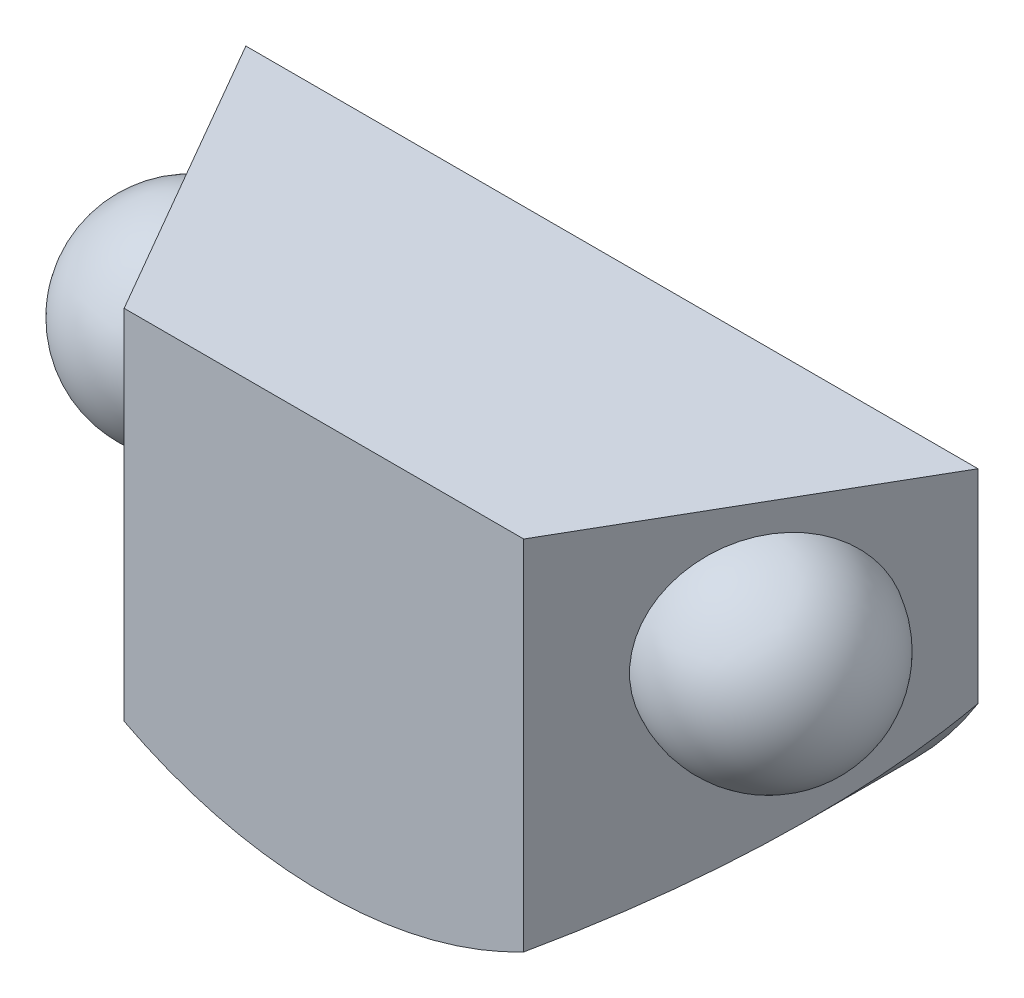
ISO-10303-21;
HEADER;
FILE_DESCRIPTION(('STEP AP214'),'2;1');
FILE_NAME('part.step','',(''),(''),'','','');
FILE_SCHEMA(('AUTOMOTIVE_DESIGN { 1 0 10303 214 1 1 1 1 }'));
ENDSEC;
DATA;
#1=APPLICATION_CONTEXT('core data for automotive mechanical design processes');
#2=APPLICATION_PROTOCOL_DEFINITION('international standard','automotive_design',2000,#1);
#3=PRODUCT_CONTEXT('',#1,'mechanical');
#4=PRODUCT('Part','Part','',(#3));
#5=PRODUCT_RELATED_PRODUCT_CATEGORY('part','',(#4));
#6=PRODUCT_DEFINITION_FORMATION('','',#4);
#7=PRODUCT_DEFINITION_CONTEXT('part definition',#1,'design');
#8=PRODUCT_DEFINITION('design','',#6,#7);
#9=PRODUCT_DEFINITION_SHAPE('','',#8);
#10=(LENGTH_UNIT() NAMED_UNIT(*) SI_UNIT(.MILLI.,.METRE.));
#11=(NAMED_UNIT(*) PLANE_ANGLE_UNIT() SI_UNIT($,.RADIAN.));
#12=(NAMED_UNIT(*) SI_UNIT($,.STERADIAN.) SOLID_ANGLE_UNIT());
#13=UNCERTAINTY_MEASURE_WITH_UNIT(LENGTH_MEASURE(1.E-05),#10,'distance_accuracy_value','');
#14=(GEOMETRIC_REPRESENTATION_CONTEXT(3) GLOBAL_UNCERTAINTY_ASSIGNED_CONTEXT((#13)) GLOBAL_UNIT_ASSIGNED_CONTEXT((#10,
#11,#12)) REPRESENTATION_CONTEXT('',''));
#15=CARTESIAN_POINT('',(0.,0.,0.));
#16=DIRECTION('',(0.,0.,1.));
#17=DIRECTION('',(1.,0.,0.));
#18=AXIS2_PLACEMENT_3D('',#15,#16,#17);
#19=CARTESIAN_POINT('',(-90.,50.,55.));
#20=DIRECTION('',(0.,0.,-1.));
#21=DIRECTION('',(-1.,0.,0.));
#22=AXIS2_PLACEMENT_3D('',#19,#20,#21);
#23=PLANE('',#22);
#24=DIRECTION('',(0.,1.,0.));
#25=VECTOR('',#24,1.);
#26=CARTESIAN_POINT('',(49.1188036855349,-50.,55.));
#27=LINE('',#26,#25);
#28=CARTESIAN_POINT('',(49.1188036855349,-37.9326520678613,55.));
#29=VERTEX_POINT('',#28);
#30=CARTESIAN_POINT('',(49.1188036855349,50.,55.));
#31=VERTEX_POINT('',#30);
#32=EDGE_CURVE('E49',#29,#31,#27,.T.);
#33=ORIENTED_EDGE('',*,*,#32,.T.);
#34=DIRECTION('',(1.,0.,0.));
#35=VECTOR('',#34,1.);
#36=CARTESIAN_POINT('',(-90.,50.,55.));
#37=LINE('',#36,#35);
#38=CARTESIAN_POINT('',(-49.1188036855349,50.,55.));
#39=VERTEX_POINT('',#38);
#40=EDGE_CURVE('E105',#39,#31,#37,.T.);
#41=ORIENTED_EDGE('',*,*,#40,.F.);
#42=DIRECTION('',(0.,1.,0.));
#43=VECTOR('',#42,1.);
#44=CARTESIAN_POINT('',(-49.1188036855349,-50.,55.));
#45=LINE('',#44,#43);
#46=CARTESIAN_POINT('',(-49.1188036855349,-37.9326520678613,55.));
#47=VERTEX_POINT('',#46);
#48=EDGE_CURVE('E85',#47,#39,#45,.T.);
#49=ORIENTED_EDGE('',*,*,#48,.F.);
#50=CARTESIAN_POINT('',(0.,56.,55.));
#51=DIRECTION('',(0.,0.,-1.));
#52=DIRECTION('',(-1.,0.,0.));
#53=AXIS2_PLACEMENT_3D('',#50,#51,#52);
#54=CIRCLE('',#53,106.);
#55=EDGE_CURVE('E56',#29,#47,#54,.T.);
#56=ORIENTED_EDGE('',*,*,#55,.F.);
#57=EDGE_LOOP('',(#33,#41,#49,#56));
#58=FACE_BOUND('',#57,.T.);
#59=ADVANCED_FACE('F35',(#58),#23,.F.);
#60=CARTESIAN_POINT('',(0.,50.,0.));
#61=DIRECTION('',(0.,-1.,0.));
#62=DIRECTION('',(0.,0.,-1.));
#63=AXIS2_PLACEMENT_3D('',#60,#61,#62);
#64=PLANE('',#63);
#65=DIRECTION('',(0.499999999999995,0.,-0.866025403784442));
#66=VECTOR('',#65,1.);
#67=CARTESIAN_POINT('',(49.1188036855349,50.,55.));
#68=LINE('',#67,#66);
#69=CARTESIAN_POINT('',(90.,50.,-15.808309090852));
#70=VERTEX_POINT('',#69);
#71=EDGE_CURVE('E94',#31,#70,#68,.T.);
#72=ORIENTED_EDGE('',*,*,#71,.T.);
#73=DIRECTION('',(1.,0.,0.));
#74=VECTOR('',#73,1.);
#75=CARTESIAN_POINT('',(-90.,50.,-15.808309090852));
#76=LINE('',#75,#74);
#77=CARTESIAN_POINT('',(-90.,50.,-15.808309090852));
#78=VERTEX_POINT('',#77);
#79=EDGE_CURVE('E79',#78,#70,#76,.T.);
#80=ORIENTED_EDGE('',*,*,#79,.F.);
#81=DIRECTION('',(-0.499999999999995,0.,-0.866025403784442));
#82=VECTOR('',#81,1.);
#83=CARTESIAN_POINT('',(-49.1188036855349,50.,55.));
#84=LINE('',#83,#82);
#85=EDGE_CURVE('E92',#39,#78,#84,.T.);
#86=ORIENTED_EDGE('',*,*,#85,.F.);
#87=ORIENTED_EDGE('',*,*,#40,.T.);
#88=EDGE_LOOP('',(#72,#80,#86,#87));
#89=FACE_BOUND('',#88,.T.);
#90=ADVANCED_FACE('F90',(#89),#64,.F.);
#91=CARTESIAN_POINT('',(0.,56.,241.815416922694));
#92=DIRECTION('',(0.,0.,-1.));
#93=DIRECTION('',(-1.,0.,0.));
#94=AXIS2_PLACEMENT_3D('',#91,#92,#93);
#95=CYLINDRICAL_SURFACE('',#94,106.);
#96=CARTESIAN_POINT('',(0.,56.,140.076263590349));
#97=DIRECTION('',(0.866025403784442,0.,-0.499999999999995));
#98=DIRECTION('',(-0.499999999999995,0.,-0.866025403784442));
#99=AXIS2_PLACEMENT_3D('',#96,#97,#98);
#100=ELLIPSE('',#99,212.000000000002,106.);
#101=CARTESIAN_POINT('',(-90.,0.,-15.808309090852));
#102=VERTEX_POINT('',#101);
#103=EDGE_CURVE('E107',#47,#102,#100,.T.);
#104=ORIENTED_EDGE('',*,*,#103,.T.);
#105=CARTESIAN_POINT('',(0.,56.,-15.808309090852));
#106=DIRECTION('',(0.,0.,1.));
#107=DIRECTION('',(1.,0.,0.));
#108=AXIS2_PLACEMENT_3D('',#105,#106,#107);
#109=CIRCLE('',#108,106.);
#110=CARTESIAN_POINT('',(90.,0.,-15.808309090852));
#111=VERTEX_POINT('',#110);
#112=EDGE_CURVE('E82',#102,#111,#109,.T.);
#113=ORIENTED_EDGE('',*,*,#112,.T.);
#114=CARTESIAN_POINT('',(0.,56.,140.076263590349));
#115=DIRECTION('',(0.866025403784442,0.,0.499999999999995));
#116=DIRECTION('',(0.499999999999995,0.,-0.866025403784442));
#117=AXIS2_PLACEMENT_3D('',#114,#115,#116);
#118=ELLIPSE('',#117,212.000000000002,106.);
#119=EDGE_CURVE('E42',#29,#111,#118,.T.);
#120=ORIENTED_EDGE('',*,*,#119,.F.);
#121=ORIENTED_EDGE('',*,*,#55,.T.);
#122=EDGE_LOOP('',(#104,#113,#120,#121));
#123=FACE_BOUND('',#122,.T.);
#124=ADVANCED_FACE('F115',(#123),#95,.T.);
#125=CARTESIAN_POINT('',(-49.1188036855349,-50.,55.));
#126=DIRECTION('',(0.866025403784442,0.,-0.499999999999995));
#127=DIRECTION('',(-0.499999999999995,0.,-0.866025403784442));
#128=AXIS2_PLACEMENT_3D('',#125,#126,#127);
#129=PLANE('',#128);
#130=CARTESIAN_POINT('',(-71.1373818974067,17.9425764885766,16.8627038266085));
#131=DIRECTION('',(0.866025403784442,0.,-0.499999999999995));
#132=DIRECTION('',(-0.499999999999995,0.,-0.866025403784442));
#133=AXIS2_PLACEMENT_3D('',#130,#131,#132);
#134=CIRCLE('',#133,25.);
#135=CARTESIAN_POINT('',(-83.6373818974066,17.9425764885766,-4.78793126800255));
#136=VERTEX_POINT('',#135);
#137=EDGE_CURVE('E109',#136,#136,#134,.T.);
#138=ORIENTED_EDGE('',*,*,#137,.T.);
#139=EDGE_LOOP('',(#138));
#140=FACE_BOUND('',#139,.T.);
#141=ORIENTED_EDGE('',*,*,#48,.T.);
#142=ORIENTED_EDGE('',*,*,#85,.T.);
#143=DIRECTION('',(0.,1.,0.));
#144=VECTOR('',#143,1.);
#145=CARTESIAN_POINT('',(-90.,-50.,-15.808309090852));
#146=LINE('',#145,#144);
#147=EDGE_CURVE('E76',#102,#78,#146,.T.);
#148=ORIENTED_EDGE('',*,*,#147,.F.);
#149=ORIENTED_EDGE('',*,*,#103,.F.);
#150=EDGE_LOOP('',(#141,#142,#148,#149));
#151=FACE_BOUND('',#150,.T.);
#152=ADVANCED_FACE('F96',(#140,#151),#129,.F.);
#153=CARTESIAN_POINT('',(49.1188036855349,-50.,55.));
#154=DIRECTION('',(0.866025403784442,0.,0.499999999999995));
#155=DIRECTION('',(0.499999999999995,0.,-0.866025403784442));
#156=AXIS2_PLACEMENT_3D('',#153,#154,#155);
#157=PLANE('',#156);
#158=CARTESIAN_POINT('',(71.1373818974067,17.9425764885766,16.8627038266085));
#159=DIRECTION('',(0.866025403784442,0.,0.499999999999995));
#160=DIRECTION('',(0.499999999999995,0.,-0.866025403784442));
#161=AXIS2_PLACEMENT_3D('',#158,#159,#160);
#162=CIRCLE('',#161,25.);
#163=CARTESIAN_POINT('',(83.6373818974066,17.9425764885766,-4.78793126800255));
#164=VERTEX_POINT('',#163);
#165=EDGE_CURVE('E11',#164,#164,#162,.T.);
#166=ORIENTED_EDGE('',*,*,#165,.F.);
#167=EDGE_LOOP('',(#166));
#168=FACE_BOUND('',#167,.T.);
#169=ORIENTED_EDGE('',*,*,#119,.T.);
#170=DIRECTION('',(0.,1.,0.));
#171=VECTOR('',#170,1.);
#172=CARTESIAN_POINT('',(90.,-50.,-15.808309090852));
#173=LINE('',#172,#171);
#174=EDGE_CURVE('E100',#111,#70,#173,.T.);
#175=ORIENTED_EDGE('',*,*,#174,.T.);
#176=ORIENTED_EDGE('',*,*,#71,.F.);
#177=ORIENTED_EDGE('',*,*,#32,.F.);
#178=EDGE_LOOP('',(#169,#175,#176,#177));
#179=FACE_BOUND('',#178,.T.);
#180=ADVANCED_FACE('F116',(#168,#179),#157,.T.);
#181=CARTESIAN_POINT('',(-71.1373818974067,17.9425764885766,16.8627038266085));
#182=DIRECTION('',(0.,1.,0.));
#183=DIRECTION('',(-0.499999999999995,0.,-0.866025403784442));
#184=AXIS2_PLACEMENT_3D('',#181,#182,#183);
#185=SPHERICAL_SURFACE('',#184,25.);
#186=CARTESIAN_POINT('',(-71.1373818974067,17.9425764885766,16.8627038266085));
#187=DIRECTION('',(0.866025403784442,0.,-0.499999999999995));
#188=DIRECTION('',(-0.499999999999995,0.,-0.866025403784442));
#189=AXIS2_PLACEMENT_3D('',#186,#187,#188);
#190=SPHERICAL_SURFACE('',#189,25.);
#191=ORIENTED_EDGE('',*,*,#137,.F.);
#192=EDGE_LOOP('',(#191));
#193=FACE_BOUND('',#192,.T.);
#194=ADVANCED_FACE('F132',(#193),#190,.T.);
#195=CARTESIAN_POINT('',(71.1373818974067,17.9425764885766,16.8627038266085));
#196=DIRECTION('',(0.,1.,0.));
#197=DIRECTION('',(0.499999999999995,0.,-0.866025403784442));
#198=AXIS2_PLACEMENT_3D('',#195,#196,#197);
#199=SPHERICAL_SURFACE('',#198,25.);
#200=CARTESIAN_POINT('',(71.1373818974067,17.9425764885766,16.8627038266085));
#201=DIRECTION('',(0.866025403784442,0.,0.499999999999995));
#202=DIRECTION('',(0.499999999999995,0.,-0.866025403784442));
#203=AXIS2_PLACEMENT_3D('',#200,#201,#202);
#204=SPHERICAL_SURFACE('',#203,25.);
#205=ORIENTED_EDGE('',*,*,#165,.T.);
#206=EDGE_LOOP('',(#205));
#207=FACE_BOUND('',#206,.T.);
#208=ADVANCED_FACE('F136',(#207),#204,.T.);
#209=CARTESIAN_POINT('',(-90.,-75.,-15.808309090852));
#210=DIRECTION('',(0.,0.,1.));
#211=DIRECTION('',(1.,0.,0.));
#212=AXIS2_PLACEMENT_3D('',#209,#210,#211);
#213=PLANE('',#212);
#214=ORIENTED_EDGE('',*,*,#147,.T.);
#215=ORIENTED_EDGE('',*,*,#79,.T.);
#216=ORIENTED_EDGE('',*,*,#174,.F.);
#217=ORIENTED_EDGE('',*,*,#112,.F.);
#218=EDGE_LOOP('',(#214,#215,#216,#217));
#219=FACE_BOUND('',#218,.T.);
#220=ADVANCED_FACE('F78',(#219),#213,.F.);
#221=CLOSED_SHELL('',(#59,#90,#124,#152,#180,#194,#208,#220));
#222=MANIFOLD_SOLID_BREP('B2',#221);
#223=ADVANCED_BREP_SHAPE_REPRESENTATION('',(#18,#222),#14);
#224=SHAPE_DEFINITION_REPRESENTATION(#9,#223);
ENDSEC;
END-ISO-10303-21;
